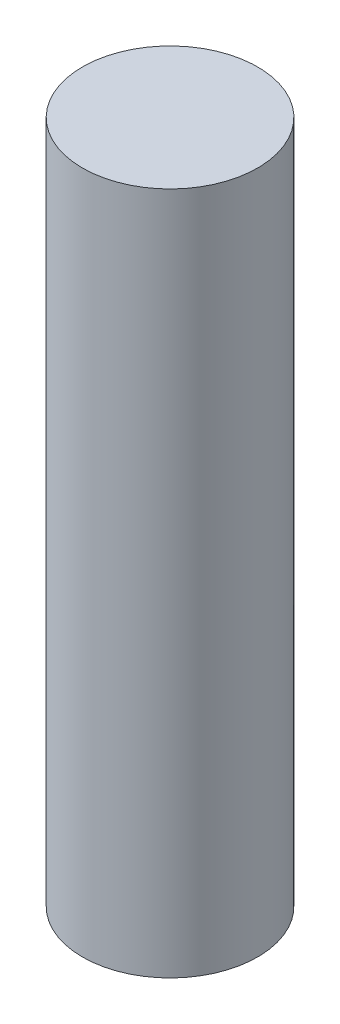
ISO-10303-21;
HEADER;
FILE_DESCRIPTION(('STEP AP214'),'2;1');
FILE_NAME('part.step','',(''),(''),'','','');
FILE_SCHEMA(('AUTOMOTIVE_DESIGN { 1 0 10303 214 1 1 1 1 }'));
ENDSEC;
DATA;
#1=APPLICATION_CONTEXT('core data for automotive mechanical design processes');
#2=APPLICATION_PROTOCOL_DEFINITION('international standard','automotive_design',2000,#1);
#3=PRODUCT_CONTEXT('',#1,'mechanical');
#4=PRODUCT('Part','Part','',(#3));
#5=PRODUCT_RELATED_PRODUCT_CATEGORY('part','',(#4));
#6=PRODUCT_DEFINITION_FORMATION('','',#4);
#7=PRODUCT_DEFINITION_CONTEXT('part definition',#1,'design');
#8=PRODUCT_DEFINITION('design','',#6,#7);
#9=PRODUCT_DEFINITION_SHAPE('','',#8);
#10=(LENGTH_UNIT() NAMED_UNIT(*) SI_UNIT(.MILLI.,.METRE.));
#11=(NAMED_UNIT(*) PLANE_ANGLE_UNIT() SI_UNIT($,.RADIAN.));
#12=(NAMED_UNIT(*) SI_UNIT($,.STERADIAN.) SOLID_ANGLE_UNIT());
#13=UNCERTAINTY_MEASURE_WITH_UNIT(LENGTH_MEASURE(1.E-05),#10,'distance_accuracy_value','');
#14=(GEOMETRIC_REPRESENTATION_CONTEXT(3) GLOBAL_UNCERTAINTY_ASSIGNED_CONTEXT((#13)) GLOBAL_UNIT_ASSIGNED_CONTEXT((#10,
#11,#12)) REPRESENTATION_CONTEXT('',''));
#15=CARTESIAN_POINT('',(0.,0.,0.));
#16=DIRECTION('',(0.,0.,1.));
#17=DIRECTION('',(1.,0.,0.));
#18=AXIS2_PLACEMENT_3D('',#15,#16,#17);
#19=CARTESIAN_POINT('',(0.,780.,0.));
#20=DIRECTION('',(0.,-1.,0.));
#21=DIRECTION('',(0.,0.,-1.));
#22=AXIS2_PLACEMENT_3D('',#19,#20,#21);
#23=CYLINDRICAL_SURFACE('',#22,100.);
#24=CARTESIAN_POINT('',(0.,780.,0.));
#25=DIRECTION('',(0.,1.,0.));
#26=DIRECTION('',(0.,0.,1.));
#27=AXIS2_PLACEMENT_3D('',#24,#25,#26);
#28=CIRCLE('',#27,100.);
#29=CARTESIAN_POINT('',(0.,780.,100.));
#30=VERTEX_POINT('',#29);
#31=EDGE_CURVE('E10',#30,#30,#28,.T.);
#32=ORIENTED_EDGE('',*,*,#31,.F.);
#33=EDGE_LOOP('',(#32));
#34=FACE_BOUND('',#33,.T.);
#35=CARTESIAN_POINT('',(0.,0.,0.));
#36=DIRECTION('',(0.,1.,0.));
#37=DIRECTION('',(0.,0.,1.));
#38=AXIS2_PLACEMENT_3D('',#35,#36,#37);
#39=CIRCLE('',#38,100.);
#40=CARTESIAN_POINT('',(0.,0.,100.));
#41=VERTEX_POINT('',#40);
#42=EDGE_CURVE('E32',#41,#41,#39,.T.);
#43=ORIENTED_EDGE('',*,*,#42,.T.);
#44=EDGE_LOOP('',(#43));
#45=FACE_BOUND('',#44,.T.);
#46=ADVANCED_FACE('F29',(#34,#45),#23,.T.);
#47=CARTESIAN_POINT('',(0.,780.,0.));
#48=DIRECTION('',(0.,1.,0.));
#49=DIRECTION('',(0.,0.,1.));
#50=AXIS2_PLACEMENT_3D('',#47,#48,#49);
#51=PLANE('',#50);
#52=ORIENTED_EDGE('',*,*,#31,.T.);
#53=EDGE_LOOP('',(#52));
#54=FACE_BOUND('',#53,.T.);
#55=ADVANCED_FACE('F44',(#54),#51,.T.);
#56=CARTESIAN_POINT('',(0.,0.,0.));
#57=DIRECTION('',(0.,1.,0.));
#58=DIRECTION('',(0.,0.,1.));
#59=AXIS2_PLACEMENT_3D('',#56,#57,#58);
#60=PLANE('',#59);
#61=ORIENTED_EDGE('',*,*,#42,.F.);
#62=EDGE_LOOP('',(#61));
#63=FACE_BOUND('',#62,.T.);
#64=ADVANCED_FACE('F42',(#63),#60,.F.);
#65=CLOSED_SHELL('',(#46,#55,#64));
#66=MANIFOLD_SOLID_BREP('B2',#65);
#67=ADVANCED_BREP_SHAPE_REPRESENTATION('',(#18,#66),#14);
#68=SHAPE_DEFINITION_REPRESENTATION(#9,#67);
ENDSEC;
END-ISO-10303-21;
